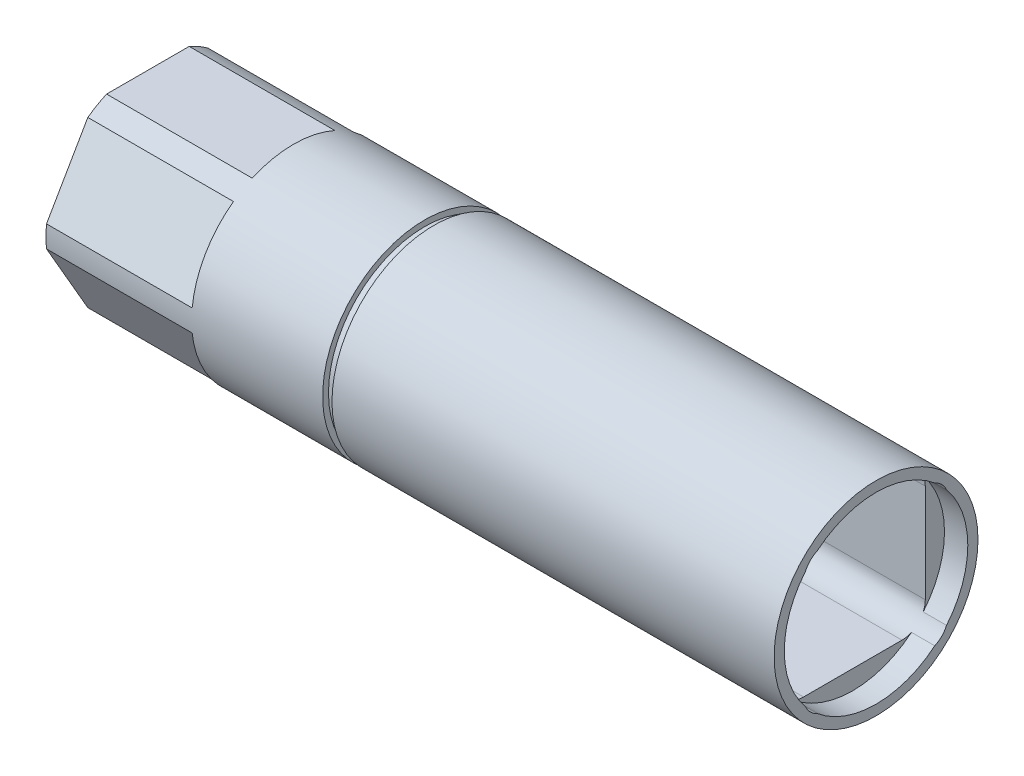
ISO-10303-21;
HEADER;
FILE_DESCRIPTION(('STEP AP214'),'2;1');
FILE_NAME('part.step','',(''),(''),'','','');
FILE_SCHEMA(('AUTOMOTIVE_DESIGN { 1 0 10303 214 1 1 1 1 }'));
ENDSEC;
DATA;
#1=APPLICATION_CONTEXT('core data for automotive mechanical design processes');
#2=APPLICATION_PROTOCOL_DEFINITION('international standard','automotive_design',2000,#1);
#3=PRODUCT_CONTEXT('',#1,'mechanical');
#4=PRODUCT('Part','Part','',(#3));
#5=PRODUCT_RELATED_PRODUCT_CATEGORY('part','',(#4));
#6=PRODUCT_DEFINITION_FORMATION('','',#4);
#7=PRODUCT_DEFINITION_CONTEXT('part definition',#1,'design');
#8=PRODUCT_DEFINITION('design','',#6,#7);
#9=PRODUCT_DEFINITION_SHAPE('','',#8);
#10=(LENGTH_UNIT() NAMED_UNIT(*) SI_UNIT(.MILLI.,.METRE.));
#11=(NAMED_UNIT(*) PLANE_ANGLE_UNIT() SI_UNIT($,.RADIAN.));
#12=(NAMED_UNIT(*) SI_UNIT($,.STERADIAN.) SOLID_ANGLE_UNIT());
#13=UNCERTAINTY_MEASURE_WITH_UNIT(LENGTH_MEASURE(1.E-05),#10,'distance_accuracy_value','');
#14=(GEOMETRIC_REPRESENTATION_CONTEXT(3) GLOBAL_UNCERTAINTY_ASSIGNED_CONTEXT((#13)) GLOBAL_UNIT_ASSIGNED_CONTEXT((#10,
#11,#12)) REPRESENTATION_CONTEXT('',''));
#15=CARTESIAN_POINT('',(0.,0.,0.));
#16=DIRECTION('',(0.,0.,1.));
#17=DIRECTION('',(1.,0.,0.));
#18=AXIS2_PLACEMENT_3D('',#15,#16,#17);
#19=CARTESIAN_POINT('',(0.,0.,0.));
#20=DIRECTION('',(1.,0.,0.));
#21=DIRECTION('',(0.,0.,-1.));
#22=AXIS2_PLACEMENT_3D('',#19,#20,#21);
#23=CYLINDRICAL_SURFACE('',#22,17.5);
#24=CARTESIAN_POINT('',(125.,0.,0.));
#25=DIRECTION('',(1.,0.,0.));
#26=DIRECTION('',(0.,0.,-1.));
#27=AXIS2_PLACEMENT_3D('',#24,#25,#26);
#28=CIRCLE('',#27,17.5);
#29=CARTESIAN_POINT('',(125.,0.,-17.5));
#30=VERTEX_POINT('',#29);
#31=EDGE_CURVE('E366',#30,#30,#28,.T.);
#32=ORIENTED_EDGE('',*,*,#31,.F.);
#33=EDGE_LOOP('',(#32));
#34=FACE_BOUND('',#33,.T.);
#35=CARTESIAN_POINT('',(49.1,0.,0.));
#36=DIRECTION('',(-1.,0.,0.));
#37=DIRECTION('',(0.,0.,1.));
#38=AXIS2_PLACEMENT_3D('',#35,#36,#37);
#39=CIRCLE('',#38,17.5);
#40=CARTESIAN_POINT('',(49.1,0.,17.5));
#41=VERTEX_POINT('',#40);
#42=EDGE_CURVE('E259',#41,#41,#39,.F.);
#43=ORIENTED_EDGE('',*,*,#42,.T.);
#44=EDGE_LOOP('',(#43));
#45=FACE_BOUND('',#44,.T.);
#46=ADVANCED_FACE('F50',(#34,#45),#23,.T.);
#47=CARTESIAN_POINT('',(121.,0.,0.));
#48=DIRECTION('',(1.,0.,0.));
#49=DIRECTION('',(0.,0.,-1.));
#50=AXIS2_PLACEMENT_3D('',#47,#48,#49);
#51=CYLINDRICAL_SURFACE('',#50,15.75);
#52=DIRECTION('',(-1.,0.,0.));
#53=VECTOR('',#52,1.);
#54=CARTESIAN_POINT('',(121.,10.0776325306588,12.1038763450808));
#55=LINE('',#54,#53);
#56=CARTESIAN_POINT('',(125.,10.0776325306588,12.1038763450808));
#57=VERTEX_POINT('',#56);
#58=CARTESIAN_POINT('',(121.,10.0776325306588,12.1038763450808));
#59=VERTEX_POINT('',#58);
#60=EDGE_CURVE('E354',#57,#59,#55,.T.);
#61=ORIENTED_EDGE('',*,*,#60,.F.);
#62=CARTESIAN_POINT('',(125.,0.,0.));
#63=DIRECTION('',(1.,0.,0.));
#64=DIRECTION('',(0.,0.,-1.));
#65=AXIS2_PLACEMENT_3D('',#62,#63,#64);
#66=CIRCLE('',#65,15.75);
#67=CARTESIAN_POINT('',(125.,-10.0776325306588,12.1038763450808));
#68=VERTEX_POINT('',#67);
#69=EDGE_CURVE('E587',#57,#68,#66,.T.);
#70=ORIENTED_EDGE('',*,*,#69,.T.);
#71=DIRECTION('',(-1.,0.,0.));
#72=VECTOR('',#71,1.);
#73=CARTESIAN_POINT('',(121.,-10.0776325306588,12.1038763450808));
#74=LINE('',#73,#72);
#75=CARTESIAN_POINT('',(121.,-10.0776325306588,12.1038763450808));
#76=VERTEX_POINT('',#75);
#77=EDGE_CURVE('E342',#76,#68,#74,.F.);
#78=ORIENTED_EDGE('',*,*,#77,.F.);
#79=CARTESIAN_POINT('',(121.,0.,0.));
#80=DIRECTION('',(1.,0.,0.));
#81=DIRECTION('',(0.,0.,-1.));
#82=AXIS2_PLACEMENT_3D('',#79,#80,#81);
#83=CIRCLE('',#82,15.75);
#84=EDGE_CURVE('E616',#59,#76,#83,.T.);
#85=ORIENTED_EDGE('',*,*,#84,.F.);
#86=EDGE_LOOP('',(#61,#70,#78,#85));
#87=FACE_BOUND('',#86,.T.);
#88=ADVANCED_FACE('F467',(#87),#51,.F.);
#89=DIRECTION('',(-1.,0.,0.));
#90=VECTOR('',#89,1.);
#91=CARTESIAN_POINT('',(121.,12.1038763450808,10.0776325306588));
#92=LINE('',#91,#90);
#93=CARTESIAN_POINT('',(121.,12.1038763450808,10.0776325306588));
#94=VERTEX_POINT('',#93);
#95=CARTESIAN_POINT('',(125.,12.1038763450808,10.0776325306588));
#96=VERTEX_POINT('',#95);
#97=EDGE_CURVE('E349',#94,#96,#92,.F.);
#98=ORIENTED_EDGE('',*,*,#97,.F.);
#99=CARTESIAN_POINT('',(121.,12.1038763450808,-10.0776325306588));
#100=VERTEX_POINT('',#99);
#101=EDGE_CURVE('E362',#100,#94,#83,.T.);
#102=ORIENTED_EDGE('',*,*,#101,.F.);
#103=DIRECTION('',(-1.,0.,0.));
#104=VECTOR('',#103,1.);
#105=CARTESIAN_POINT('',(121.,12.1038763450808,-10.0776325306588));
#106=LINE('',#105,#104);
#107=CARTESIAN_POINT('',(125.,12.1038763450808,-10.0776325306588));
#108=VERTEX_POINT('',#107);
#109=EDGE_CURVE('E333',#108,#100,#106,.T.);
#110=ORIENTED_EDGE('',*,*,#109,.F.);
#111=EDGE_CURVE('E361',#108,#96,#66,.T.);
#112=ORIENTED_EDGE('',*,*,#111,.T.);
#113=EDGE_LOOP('',(#98,#102,#110,#112));
#114=FACE_BOUND('',#113,.T.);
#115=ADVANCED_FACE('F472',(#114),#51,.F.);
#116=DIRECTION('',(-1.,0.,0.));
#117=VECTOR('',#116,1.);
#118=CARTESIAN_POINT('',(121.,-12.1038763450808,10.0776325306588));
#119=LINE('',#118,#117);
#120=CARTESIAN_POINT('',(125.,-12.1038763450808,10.0776325306588));
#121=VERTEX_POINT('',#120);
#122=CARTESIAN_POINT('',(121.,-12.1038763450808,10.0776325306588));
#123=VERTEX_POINT('',#122);
#124=EDGE_CURVE('E347',#121,#123,#119,.T.);
#125=ORIENTED_EDGE('',*,*,#124,.F.);
#126=CARTESIAN_POINT('',(125.,-12.1038763450808,-10.0776325306588));
#127=VERTEX_POINT('',#126);
#128=EDGE_CURVE('E365',#121,#127,#66,.T.);
#129=ORIENTED_EDGE('',*,*,#128,.T.);
#130=DIRECTION('',(-1.,0.,0.));
#131=VECTOR('',#130,1.);
#132=CARTESIAN_POINT('',(121.,-12.1038763450808,-10.0776325306588));
#133=LINE('',#132,#131);
#134=CARTESIAN_POINT('',(121.,-12.1038763450808,-10.0776325306588));
#135=VERTEX_POINT('',#134);
#136=EDGE_CURVE('E335',#135,#127,#133,.F.);
#137=ORIENTED_EDGE('',*,*,#136,.F.);
#138=EDGE_CURVE('E360',#123,#135,#83,.T.);
#139=ORIENTED_EDGE('',*,*,#138,.F.);
#140=EDGE_LOOP('',(#125,#129,#137,#139));
#141=FACE_BOUND('',#140,.T.);
#142=ADVANCED_FACE('F597',(#141),#51,.F.);
#143=DIRECTION('',(-1.,0.,0.));
#144=VECTOR('',#143,1.);
#145=CARTESIAN_POINT('',(121.,-10.0776325306588,-12.1038763450808));
#146=LINE('',#145,#144);
#147=CARTESIAN_POINT('',(125.,-10.0776325306588,-12.1038763450808));
#148=VERTEX_POINT('',#147);
#149=CARTESIAN_POINT('',(121.,-10.0776325306588,-12.1038763450808));
#150=VERTEX_POINT('',#149);
#151=EDGE_CURVE('E340',#148,#150,#146,.T.);
#152=ORIENTED_EDGE('',*,*,#151,.F.);
#153=CARTESIAN_POINT('',(125.,10.0776325306588,-12.1038763450808));
#154=VERTEX_POINT('',#153);
#155=EDGE_CURVE('E356',#148,#154,#66,.T.);
#156=ORIENTED_EDGE('',*,*,#155,.T.);
#157=DIRECTION('',(-1.,0.,0.));
#158=VECTOR('',#157,1.);
#159=CARTESIAN_POINT('',(121.,10.0776325306588,-12.1038763450808));
#160=LINE('',#159,#158);
#161=CARTESIAN_POINT('',(121.,10.0776325306588,-12.1038763450808));
#162=VERTEX_POINT('',#161);
#163=EDGE_CURVE('E328',#162,#154,#160,.F.);
#164=ORIENTED_EDGE('',*,*,#163,.F.);
#165=EDGE_CURVE('E357',#150,#162,#83,.T.);
#166=ORIENTED_EDGE('',*,*,#165,.F.);
#167=EDGE_LOOP('',(#152,#156,#164,#166));
#168=FACE_BOUND('',#167,.T.);
#169=ADVANCED_FACE('F475',(#168),#51,.F.);
#170=CARTESIAN_POINT('',(121.,0.,0.));
#171=DIRECTION('',(1.,0.,0.));
#172=DIRECTION('',(0.,0.,-1.));
#173=AXIS2_PLACEMENT_3D('',#170,#171,#172);
#174=PLANE('',#173);
#175=DIRECTION('',(0.,1.,0.));
#176=VECTOR('',#175,1.);
#177=CARTESIAN_POINT('',(121.,0.,12.45));
#178=LINE('',#177,#176);
#179=CARTESIAN_POINT('',(121.,-8.45,12.45));
#180=VERTEX_POINT('',#179);
#181=CARTESIAN_POINT('',(121.,8.45,12.45));
#182=VERTEX_POINT('',#181);
#183=EDGE_CURVE('E399',#180,#182,#178,.T.);
#184=ORIENTED_EDGE('',*,*,#183,.T.);
#185=CARTESIAN_POINT('',(121.,8.45,8.45));
#186=DIRECTION('',(1.,0.,0.));
#187=DIRECTION('',(0.,0.,-1.));
#188=AXIS2_PLACEMENT_3D('',#185,#186,#187);
#189=CIRCLE('',#188,4.);
#190=EDGE_CURVE('E384',#182,#59,#189,.F.);
#191=ORIENTED_EDGE('',*,*,#190,.T.);
#192=ORIENTED_EDGE('',*,*,#84,.T.);
#193=CARTESIAN_POINT('',(121.,-8.45,8.45));
#194=DIRECTION('',(1.,0.,0.));
#195=DIRECTION('',(0.,0.,-1.));
#196=AXIS2_PLACEMENT_3D('',#193,#194,#195);
#197=CIRCLE('',#196,4.);
#198=EDGE_CURVE('E398',#76,#180,#197,.F.);
#199=ORIENTED_EDGE('',*,*,#198,.T.);
#200=EDGE_LOOP('',(#184,#191,#192,#199));
#201=FACE_BOUND('',#200,.T.);
#202=ADVANCED_FACE('F572',(#201),#174,.T.);
#203=DIRECTION('',(0.,0.,1.));
#204=VECTOR('',#203,1.);
#205=CARTESIAN_POINT('',(121.,-12.45,0.));
#206=LINE('',#205,#204);
#207=CARTESIAN_POINT('',(121.,-12.45,-8.45));
#208=VERTEX_POINT('',#207);
#209=CARTESIAN_POINT('',(121.,-12.45,8.45));
#210=VERTEX_POINT('',#209);
#211=EDGE_CURVE('E392',#208,#210,#206,.T.);
#212=ORIENTED_EDGE('',*,*,#211,.T.);
#213=EDGE_CURVE('E395',#210,#123,#197,.F.);
#214=ORIENTED_EDGE('',*,*,#213,.T.);
#215=ORIENTED_EDGE('',*,*,#138,.T.);
#216=CARTESIAN_POINT('',(121.,-8.45,-8.45));
#217=DIRECTION('',(1.,0.,0.));
#218=DIRECTION('',(0.,0.,-1.));
#219=AXIS2_PLACEMENT_3D('',#216,#217,#218);
#220=CIRCLE('',#219,4.);
#221=EDGE_CURVE('E391',#135,#208,#220,.F.);
#222=ORIENTED_EDGE('',*,*,#221,.T.);
#223=EDGE_LOOP('',(#212,#214,#215,#222));
#224=FACE_BOUND('',#223,.T.);
#225=ADVANCED_FACE('F574',(#224),#174,.T.);
#226=DIRECTION('',(0.,-1.,0.));
#227=VECTOR('',#226,1.);
#228=CARTESIAN_POINT('',(121.,0.,-12.45));
#229=LINE('',#228,#227);
#230=CARTESIAN_POINT('',(121.,8.45,-12.45));
#231=VERTEX_POINT('',#230);
#232=CARTESIAN_POINT('',(121.,-8.45,-12.45));
#233=VERTEX_POINT('',#232);
#234=EDGE_CURVE('E385',#231,#233,#229,.T.);
#235=ORIENTED_EDGE('',*,*,#234,.T.);
#236=EDGE_CURVE('E388',#233,#150,#220,.F.);
#237=ORIENTED_EDGE('',*,*,#236,.T.);
#238=ORIENTED_EDGE('',*,*,#165,.T.);
#239=CARTESIAN_POINT('',(121.,8.45,-8.45));
#240=DIRECTION('',(1.,0.,0.));
#241=DIRECTION('',(0.,0.,-1.));
#242=AXIS2_PLACEMENT_3D('',#239,#240,#241);
#243=CIRCLE('',#242,4.);
#244=EDGE_CURVE('E381',#162,#231,#243,.F.);
#245=ORIENTED_EDGE('',*,*,#244,.T.);
#246=EDGE_LOOP('',(#235,#237,#238,#245));
#247=FACE_BOUND('',#246,.T.);
#248=ADVANCED_FACE('F582',(#247),#174,.T.);
#249=ORIENTED_EDGE('',*,*,#101,.T.);
#250=CARTESIAN_POINT('',(121.,12.45,8.45));
#251=VERTEX_POINT('',#250);
#252=EDGE_CURVE('E380',#94,#251,#189,.F.);
#253=ORIENTED_EDGE('',*,*,#252,.T.);
#254=DIRECTION('',(0.,0.,-1.));
#255=VECTOR('',#254,1.);
#256=CARTESIAN_POINT('',(121.,12.45,0.));
#257=LINE('',#256,#255);
#258=CARTESIAN_POINT('',(121.,12.45,-8.45));
#259=VERTEX_POINT('',#258);
#260=EDGE_CURVE('E374',#251,#259,#257,.T.);
#261=ORIENTED_EDGE('',*,*,#260,.T.);
#262=EDGE_CURVE('E377',#259,#100,#243,.F.);
#263=ORIENTED_EDGE('',*,*,#262,.T.);
#264=EDGE_LOOP('',(#249,#253,#261,#263));
#265=FACE_BOUND('',#264,.T.);
#266=ADVANCED_FACE('F576',(#265),#174,.T.);
#267=CARTESIAN_POINT('',(125.,17.5,0.));
#268=DIRECTION('',(1.,0.,0.));
#269=DIRECTION('',(0.,0.,-1.));
#270=AXIS2_PLACEMENT_3D('',#267,#268,#269);
#271=PLANE('',#270);
#272=ORIENTED_EDGE('',*,*,#69,.F.);
#273=CARTESIAN_POINT('',(125.,8.45,8.45));
#274=DIRECTION('',(1.,0.,0.));
#275=DIRECTION('',(0.,0.,-1.));
#276=AXIS2_PLACEMENT_3D('',#273,#274,#275);
#277=CIRCLE('',#276,4.);
#278=EDGE_CURVE('E351',#57,#96,#277,.F.);
#279=ORIENTED_EDGE('',*,*,#278,.T.);
#280=ORIENTED_EDGE('',*,*,#111,.F.);
#281=CARTESIAN_POINT('',(125.,8.45,-8.45));
#282=DIRECTION('',(1.,0.,0.));
#283=DIRECTION('',(0.,0.,-1.));
#284=AXIS2_PLACEMENT_3D('',#281,#282,#283);
#285=CIRCLE('',#284,4.);
#286=EDGE_CURVE('E330',#108,#154,#285,.F.);
#287=ORIENTED_EDGE('',*,*,#286,.T.);
#288=ORIENTED_EDGE('',*,*,#155,.F.);
#289=CARTESIAN_POINT('',(125.,-8.45,-8.45));
#290=DIRECTION('',(1.,0.,0.));
#291=DIRECTION('',(0.,0.,-1.));
#292=AXIS2_PLACEMENT_3D('',#289,#290,#291);
#293=CIRCLE('',#292,4.);
#294=EDGE_CURVE('E337',#148,#127,#293,.F.);
#295=ORIENTED_EDGE('',*,*,#294,.T.);
#296=ORIENTED_EDGE('',*,*,#128,.F.);
#297=CARTESIAN_POINT('',(125.,-8.45,8.45));
#298=DIRECTION('',(1.,0.,0.));
#299=DIRECTION('',(0.,0.,-1.));
#300=AXIS2_PLACEMENT_3D('',#297,#298,#299);
#301=CIRCLE('',#300,4.);
#302=EDGE_CURVE('E344',#121,#68,#301,.F.);
#303=ORIENTED_EDGE('',*,*,#302,.T.);
#304=EDGE_LOOP('',(#272,#279,#280,#287,#288,#295,#296,#303));
#305=FACE_BOUND('',#304,.T.);
#306=ORIENTED_EDGE('',*,*,#31,.T.);
#307=EDGE_LOOP('',(#306));
#308=FACE_BOUND('',#307,.T.);
#309=ADVANCED_FACE('F570',(#305,#308),#271,.T.);
#310=CARTESIAN_POINT('',(146.,8.45,8.45));
#311=DIRECTION('',(-1.,0.,0.));
#312=DIRECTION('',(0.,0.,1.));
#313=AXIS2_PLACEMENT_3D('',#310,#311,#312);
#314=CYLINDRICAL_SURFACE('',#313,4.);
#315=DIRECTION('',(-1.,0.,0.));
#316=VECTOR('',#315,1.);
#317=CARTESIAN_POINT('',(146.,8.45,12.45));
#318=LINE('',#317,#316);
#319=CARTESIAN_POINT('',(96.,8.45,12.45));
#320=VERTEX_POINT('',#319);
#321=EDGE_CURVE('E326',#182,#320,#318,.T.);
#322=ORIENTED_EDGE('',*,*,#321,.T.);
#323=CARTESIAN_POINT('',(96.,8.45,8.45));
#324=DIRECTION('',(1.,0.,0.));
#325=DIRECTION('',(0.,0.,1.));
#326=AXIS2_PLACEMENT_3D('',#323,#324,#325);
#327=CIRCLE('',#326,4.);
#328=CARTESIAN_POINT('',(96.,12.45,8.45));
#329=VERTEX_POINT('',#328);
#330=EDGE_CURVE('E271',#329,#320,#327,.T.);
#331=ORIENTED_EDGE('',*,*,#330,.F.);
#332=DIRECTION('',(-1.,0.,0.));
#333=VECTOR('',#332,1.);
#334=CARTESIAN_POINT('',(146.,12.45,8.45));
#335=LINE('',#334,#333);
#336=EDGE_CURVE('E312',#251,#329,#335,.T.);
#337=ORIENTED_EDGE('',*,*,#336,.F.);
#338=ORIENTED_EDGE('',*,*,#252,.F.);
#339=ORIENTED_EDGE('',*,*,#97,.T.);
#340=ORIENTED_EDGE('',*,*,#278,.F.);
#341=ORIENTED_EDGE('',*,*,#60,.T.);
#342=ORIENTED_EDGE('',*,*,#190,.F.);
#343=EDGE_LOOP('',(#322,#331,#337,#338,#339,#340,#341,#342));
#344=FACE_BOUND('',#343,.T.);
#345=ADVANCED_FACE('F566',(#344),#314,.F.);
#346=CARTESIAN_POINT('',(146.,8.45,12.45));
#347=DIRECTION('',(0.,0.,-1.));
#348=DIRECTION('',(0.,1.,0.));
#349=AXIS2_PLACEMENT_3D('',#346,#347,#348);
#350=PLANE('',#349);
#351=DIRECTION('',(-1.,0.,0.));
#352=VECTOR('',#351,1.);
#353=CARTESIAN_POINT('',(146.,-8.45,12.45));
#354=LINE('',#353,#352);
#355=CARTESIAN_POINT('',(96.,-8.45,12.45));
#356=VERTEX_POINT('',#355);
#357=EDGE_CURVE('E324',#180,#356,#354,.T.);
#358=ORIENTED_EDGE('',*,*,#357,.T.);
#359=DIRECTION('',(0.,-1.,0.));
#360=VECTOR('',#359,1.);
#361=CARTESIAN_POINT('',(96.,8.45,12.45));
#362=LINE('',#361,#360);
#363=EDGE_CURVE('E291',#320,#356,#362,.T.);
#364=ORIENTED_EDGE('',*,*,#363,.F.);
#365=ORIENTED_EDGE('',*,*,#321,.F.);
#366=ORIENTED_EDGE('',*,*,#183,.F.);
#367=EDGE_LOOP('',(#358,#364,#365,#366));
#368=FACE_BOUND('',#367,.T.);
#369=ADVANCED_FACE('F562',(#368),#350,.T.);
#370=CARTESIAN_POINT('',(146.,-8.45,8.45));
#371=DIRECTION('',(-1.,0.,0.));
#372=DIRECTION('',(0.,0.,1.));
#373=AXIS2_PLACEMENT_3D('',#370,#371,#372);
#374=CYLINDRICAL_SURFACE('',#373,4.);
#375=DIRECTION('',(-1.,0.,0.));
#376=VECTOR('',#375,1.);
#377=CARTESIAN_POINT('',(146.,-12.45,8.45));
#378=LINE('',#377,#376);
#379=CARTESIAN_POINT('',(96.,-12.45,8.45));
#380=VERTEX_POINT('',#379);
#381=EDGE_CURVE('E322',#210,#380,#378,.T.);
#382=ORIENTED_EDGE('',*,*,#381,.T.);
#383=CARTESIAN_POINT('',(96.,-8.45,8.45));
#384=DIRECTION('',(1.,0.,0.));
#385=DIRECTION('',(0.,0.,-1.));
#386=AXIS2_PLACEMENT_3D('',#383,#384,#385);
#387=CIRCLE('',#386,4.);
#388=EDGE_CURVE('E294',#356,#380,#387,.T.);
#389=ORIENTED_EDGE('',*,*,#388,.F.);
#390=ORIENTED_EDGE('',*,*,#357,.F.);
#391=ORIENTED_EDGE('',*,*,#198,.F.);
#392=ORIENTED_EDGE('',*,*,#77,.T.);
#393=ORIENTED_EDGE('',*,*,#302,.F.);
#394=ORIENTED_EDGE('',*,*,#124,.T.);
#395=ORIENTED_EDGE('',*,*,#213,.F.);
#396=EDGE_LOOP('',(#382,#389,#390,#391,#392,#393,#394,#395));
#397=FACE_BOUND('',#396,.T.);
#398=ADVANCED_FACE('F558',(#397),#374,.F.);
#399=CARTESIAN_POINT('',(146.,-12.45,8.45));
#400=DIRECTION('',(0.,1.,0.));
#401=DIRECTION('',(0.,0.,1.));
#402=AXIS2_PLACEMENT_3D('',#399,#400,#401);
#403=PLANE('',#402);
#404=DIRECTION('',(-1.,0.,0.));
#405=VECTOR('',#404,1.);
#406=CARTESIAN_POINT('',(146.,-12.45,-8.45));
#407=LINE('',#406,#405);
#408=CARTESIAN_POINT('',(96.,-12.45,-8.45));
#409=VERTEX_POINT('',#408);
#410=EDGE_CURVE('E320',#208,#409,#407,.T.);
#411=ORIENTED_EDGE('',*,*,#410,.T.);
#412=DIRECTION('',(0.,0.,-1.));
#413=VECTOR('',#412,1.);
#414=CARTESIAN_POINT('',(96.,-12.45,8.45));
#415=LINE('',#414,#413);
#416=EDGE_CURVE('E297',#380,#409,#415,.T.);
#417=ORIENTED_EDGE('',*,*,#416,.F.);
#418=ORIENTED_EDGE('',*,*,#381,.F.);
#419=ORIENTED_EDGE('',*,*,#211,.F.);
#420=EDGE_LOOP('',(#411,#417,#418,#419));
#421=FACE_BOUND('',#420,.T.);
#422=ADVANCED_FACE('F554',(#421),#403,.T.);
#423=CARTESIAN_POINT('',(146.,-8.45,-8.45));
#424=DIRECTION('',(-1.,0.,0.));
#425=DIRECTION('',(0.,0.,1.));
#426=AXIS2_PLACEMENT_3D('',#423,#424,#425);
#427=CYLINDRICAL_SURFACE('',#426,4.);
#428=DIRECTION('',(-1.,0.,0.));
#429=VECTOR('',#428,1.);
#430=CARTESIAN_POINT('',(146.,-8.45,-12.45));
#431=LINE('',#430,#429);
#432=CARTESIAN_POINT('',(96.,-8.45,-12.45));
#433=VERTEX_POINT('',#432);
#434=EDGE_CURVE('E318',#233,#433,#431,.T.);
#435=ORIENTED_EDGE('',*,*,#434,.T.);
#436=CARTESIAN_POINT('',(96.,-8.45,-8.45));
#437=DIRECTION('',(1.,0.,0.));
#438=DIRECTION('',(0.,0.,1.));
#439=AXIS2_PLACEMENT_3D('',#436,#437,#438);
#440=CIRCLE('',#439,4.);
#441=EDGE_CURVE('E300',#409,#433,#440,.T.);
#442=ORIENTED_EDGE('',*,*,#441,.F.);
#443=ORIENTED_EDGE('',*,*,#410,.F.);
#444=ORIENTED_EDGE('',*,*,#221,.F.);
#445=ORIENTED_EDGE('',*,*,#136,.T.);
#446=ORIENTED_EDGE('',*,*,#294,.F.);
#447=ORIENTED_EDGE('',*,*,#151,.T.);
#448=ORIENTED_EDGE('',*,*,#236,.F.);
#449=EDGE_LOOP('',(#435,#442,#443,#444,#445,#446,#447,#448));
#450=FACE_BOUND('',#449,.T.);
#451=ADVANCED_FACE('F550',(#450),#427,.F.);
#452=CARTESIAN_POINT('',(146.,8.45,-12.45));
#453=DIRECTION('',(0.,0.,1.));
#454=DIRECTION('',(1.,0.,0.));
#455=AXIS2_PLACEMENT_3D('',#452,#453,#454);
#456=PLANE('',#455);
#457=DIRECTION('',(-1.,0.,0.));
#458=VECTOR('',#457,1.);
#459=CARTESIAN_POINT('',(146.,8.45,-12.45));
#460=LINE('',#459,#458);
#461=CARTESIAN_POINT('',(96.,8.45,-12.45));
#462=VERTEX_POINT('',#461);
#463=EDGE_CURVE('E316',#231,#462,#460,.T.);
#464=ORIENTED_EDGE('',*,*,#463,.T.);
#465=DIRECTION('',(0.,1.,0.));
#466=VECTOR('',#465,1.);
#467=CARTESIAN_POINT('',(96.,8.45,-12.45));
#468=LINE('',#467,#466);
#469=EDGE_CURVE('E303',#433,#462,#468,.T.);
#470=ORIENTED_EDGE('',*,*,#469,.F.);
#471=ORIENTED_EDGE('',*,*,#434,.F.);
#472=ORIENTED_EDGE('',*,*,#234,.F.);
#473=EDGE_LOOP('',(#464,#470,#471,#472));
#474=FACE_BOUND('',#473,.T.);
#475=ADVANCED_FACE('F546',(#474),#456,.T.);
#476=CARTESIAN_POINT('',(146.,8.45,-8.45));
#477=DIRECTION('',(-1.,0.,0.));
#478=DIRECTION('',(0.,0.,1.));
#479=AXIS2_PLACEMENT_3D('',#476,#477,#478);
#480=CYLINDRICAL_SURFACE('',#479,4.);
#481=DIRECTION('',(-1.,0.,0.));
#482=VECTOR('',#481,1.);
#483=CARTESIAN_POINT('',(146.,12.45,-8.45));
#484=LINE('',#483,#482);
#485=CARTESIAN_POINT('',(96.,12.45,-8.45));
#486=VERTEX_POINT('',#485);
#487=EDGE_CURVE('E314',#259,#486,#484,.T.);
#488=ORIENTED_EDGE('',*,*,#487,.T.);
#489=CARTESIAN_POINT('',(96.,8.45,-8.45));
#490=DIRECTION('',(1.,0.,0.));
#491=DIRECTION('',(0.,0.,1.));
#492=AXIS2_PLACEMENT_3D('',#489,#490,#491);
#493=CIRCLE('',#492,4.);
#494=EDGE_CURVE('E306',#462,#486,#493,.T.);
#495=ORIENTED_EDGE('',*,*,#494,.F.);
#496=ORIENTED_EDGE('',*,*,#463,.F.);
#497=ORIENTED_EDGE('',*,*,#244,.F.);
#498=ORIENTED_EDGE('',*,*,#163,.T.);
#499=ORIENTED_EDGE('',*,*,#286,.F.);
#500=ORIENTED_EDGE('',*,*,#109,.T.);
#501=ORIENTED_EDGE('',*,*,#262,.F.);
#502=EDGE_LOOP('',(#488,#495,#496,#497,#498,#499,#500,#501));
#503=FACE_BOUND('',#502,.T.);
#504=ADVANCED_FACE('F542',(#503),#480,.F.);
#505=CARTESIAN_POINT('',(146.,12.45,8.45));
#506=DIRECTION('',(0.,-1.,0.));
#507=DIRECTION('',(0.,0.,-1.));
#508=AXIS2_PLACEMENT_3D('',#505,#506,#507);
#509=PLANE('',#508);
#510=ORIENTED_EDGE('',*,*,#336,.T.);
#511=DIRECTION('',(0.,0.,1.));
#512=VECTOR('',#511,1.);
#513=CARTESIAN_POINT('',(96.,12.45,8.45));
#514=LINE('',#513,#512);
#515=EDGE_CURVE('E309',#486,#329,#514,.T.);
#516=ORIENTED_EDGE('',*,*,#515,.F.);
#517=ORIENTED_EDGE('',*,*,#487,.F.);
#518=ORIENTED_EDGE('',*,*,#260,.F.);
#519=EDGE_LOOP('',(#510,#516,#517,#518));
#520=FACE_BOUND('',#519,.T.);
#521=ADVANCED_FACE('F538',(#520),#509,.T.);
#522=CARTESIAN_POINT('',(96.,8.45,8.45));
#523=DIRECTION('',(-1.,0.,0.));
#524=DIRECTION('',(0.,0.,1.));
#525=AXIS2_PLACEMENT_3D('',#522,#523,#524);
#526=PLANE('',#525);
#527=ORIENTED_EDGE('',*,*,#330,.T.);
#528=ORIENTED_EDGE('',*,*,#363,.T.);
#529=ORIENTED_EDGE('',*,*,#388,.T.);
#530=ORIENTED_EDGE('',*,*,#416,.T.);
#531=ORIENTED_EDGE('',*,*,#441,.T.);
#532=ORIENTED_EDGE('',*,*,#469,.T.);
#533=ORIENTED_EDGE('',*,*,#494,.T.);
#534=ORIENTED_EDGE('',*,*,#515,.T.);
#535=EDGE_LOOP('',(#527,#528,#529,#530,#531,#532,#533,#534));
#536=FACE_BOUND('',#535,.T.);
#537=ADVANCED_FACE('F452',(#536),#526,.F.);
#538=CARTESIAN_POINT('',(47.5,0.,-29.4669668590395));
#539=DIRECTION('',(1.,0.,0.));
#540=DIRECTION('',(0.,0.,-1.));
#541=AXIS2_PLACEMENT_3D('',#538,#539,#540);
#542=PLANE('',#541);
#543=CARTESIAN_POINT('',(47.5,0.,0.));
#544=DIRECTION('',(1.,0.,0.));
#545=DIRECTION('',(0.,0.,-1.));
#546=AXIS2_PLACEMENT_3D('',#543,#544,#545);
#547=CIRCLE('',#546,17.5);
#548=CARTESIAN_POINT('',(47.5,0.,-17.5));
#549=VERTEX_POINT('',#548);
#550=EDGE_CURVE('E54',#549,#549,#547,.F.);
#551=ORIENTED_EDGE('',*,*,#550,.F.);
#552=EDGE_LOOP('',(#551));
#553=FACE_BOUND('',#552,.T.);
#554=CARTESIAN_POINT('',(47.5,0.,0.));
#555=DIRECTION('',(-1.,0.,0.));
#556=DIRECTION('',(0.,0.,1.));
#557=AXIS2_PLACEMENT_3D('',#554,#555,#556);
#558=CIRCLE('',#557,16.5);
#559=CARTESIAN_POINT('',(47.5,0.,16.5));
#560=VERTEX_POINT('',#559);
#561=EDGE_CURVE('E252',#560,#560,#558,.T.);
#562=ORIENTED_EDGE('',*,*,#561,.T.);
#563=EDGE_LOOP('',(#562));
#564=FACE_BOUND('',#563,.T.);
#565=ADVANCED_FACE('F448',(#553,#564),#542,.T.);
#566=CARTESIAN_POINT('',(0.,0.,0.));
#567=DIRECTION('',(-1.,0.,0.));
#568=DIRECTION('',(0.,0.,1.));
#569=AXIS2_PLACEMENT_3D('',#566,#567,#568);
#570=CYLINDRICAL_SURFACE('',#569,16.5);
#571=CARTESIAN_POINT('',(49.1,0.,0.));
#572=DIRECTION('',(-1.,0.,0.));
#573=DIRECTION('',(0.,0.,1.));
#574=AXIS2_PLACEMENT_3D('',#571,#572,#573);
#575=CIRCLE('',#574,16.5);
#576=CARTESIAN_POINT('',(49.1,0.,16.5));
#577=VERTEX_POINT('',#576);
#578=EDGE_CURVE('E248',#577,#577,#575,.T.);
#579=ORIENTED_EDGE('',*,*,#578,.T.);
#580=EDGE_LOOP('',(#579));
#581=FACE_BOUND('',#580,.T.);
#582=ORIENTED_EDGE('',*,*,#561,.F.);
#583=EDGE_LOOP('',(#582));
#584=FACE_BOUND('',#583,.T.);
#585=ADVANCED_FACE('F451',(#581,#584),#570,.T.);
#586=CARTESIAN_POINT('',(49.1,0.,-29.4669668590395));
#587=DIRECTION('',(-1.,0.,0.));
#588=DIRECTION('',(0.,0.,1.));
#589=AXIS2_PLACEMENT_3D('',#586,#587,#588);
#590=PLANE('',#589);
#591=ORIENTED_EDGE('',*,*,#42,.F.);
#592=EDGE_LOOP('',(#591));
#593=FACE_BOUND('',#592,.T.);
#594=ORIENTED_EDGE('',*,*,#578,.F.);
#595=EDGE_LOOP('',(#594));
#596=FACE_BOUND('',#595,.T.);
#597=ADVANCED_FACE('F457',(#593,#596),#590,.T.);
#598=CARTESIAN_POINT('',(25.,0.,0.));
#599=DIRECTION('',(-1.,0.,0.));
#600=DIRECTION('',(0.,0.,1.));
#601=AXIS2_PLACEMENT_3D('',#598,#599,#600);
#602=PLANE('',#601);
#603=DIRECTION('',(0.,0.,-1.));
#604=VECTOR('',#603,1.);
#605=CARTESIAN_POINT('',(25.,16.,9.23760430703401));
#606=LINE('',#605,#604);
#607=CARTESIAN_POINT('',(25.,16.,7.08872343937891));
#608=VERTEX_POINT('',#607);
#609=CARTESIAN_POINT('',(25.,16.,-7.08872343937891));
#610=VERTEX_POINT('',#609);
#611=EDGE_CURVE('E261',#608,#610,#606,.T.);
#612=ORIENTED_EDGE('',*,*,#611,.F.);
#613=CARTESIAN_POINT('',(25.,0.,0.));
#614=DIRECTION('',(-1.,0.,0.));
#615=DIRECTION('',(0.,0.,1.));
#616=AXIS2_PLACEMENT_3D('',#613,#614,#615);
#617=CIRCLE('',#616,17.5);
#618=EDGE_CURVE('E405',#610,#608,#617,.F.);
#619=ORIENTED_EDGE('',*,*,#618,.F.);
#620=EDGE_LOOP('',(#612,#619));
#621=FACE_BOUND('',#620,.T.);
#622=ADVANCED_FACE('F463',(#621),#602,.T.);
#623=CARTESIAN_POINT('',(25.,16.,9.23760430703401));
#624=DIRECTION('',(0.,1.,0.));
#625=DIRECTION('',(0.,0.,1.));
#626=AXIS2_PLACEMENT_3D('',#623,#624,#625);
#627=PLANE('',#626);
#628=ORIENTED_EDGE('',*,*,#611,.T.);
#629=DIRECTION('',(1.,0.,0.));
#630=VECTOR('',#629,1.);
#631=CARTESIAN_POINT('',(0.,16.,-7.08872343937891));
#632=LINE('',#631,#630);
#633=CARTESIAN_POINT('',(0.,16.,-7.08872343937891));
#634=VERTEX_POINT('',#633);
#635=EDGE_CURVE('E402',#634,#610,#632,.T.);
#636=ORIENTED_EDGE('',*,*,#635,.F.);
#637=DIRECTION('',(0.,0.,-1.));
#638=VECTOR('',#637,1.);
#639=CARTESIAN_POINT('',(0.,16.,9.23760430703401));
#640=LINE('',#639,#638);
#641=CARTESIAN_POINT('',(0.,16.,7.08872343937891));
#642=VERTEX_POINT('',#641);
#643=EDGE_CURVE('E275',#642,#634,#640,.T.);
#644=ORIENTED_EDGE('',*,*,#643,.F.);
#645=DIRECTION('',(1.,0.,0.));
#646=VECTOR('',#645,1.);
#647=CARTESIAN_POINT('',(0.,16.,7.08872343937891));
#648=LINE('',#647,#646);
#649=EDGE_CURVE('E408',#608,#642,#648,.F.);
#650=ORIENTED_EDGE('',*,*,#649,.F.);
#651=EDGE_LOOP('',(#628,#636,#644,#650));
#652=FACE_BOUND('',#651,.T.);
#653=ADVANCED_FACE('F523',(#652),#627,.T.);
#654=DIRECTION('',(0.,-0.866025403784439,-0.5));
#655=VECTOR('',#654,1.);
#656=CARTESIAN_POINT('',(25.,16.,-9.23760430703401));
#657=LINE('',#656,#655);
#658=CARTESIAN_POINT('',(25.,14.1390145789043,-10.3120447408616));
#659=VERTEX_POINT('',#658);
#660=CARTESIAN_POINT('',(25.,1.86098542109566,-17.4007681802405));
#661=VERTEX_POINT('',#660);
#662=EDGE_CURVE('E264',#659,#661,#657,.T.);
#663=ORIENTED_EDGE('',*,*,#662,.F.);
#664=EDGE_CURVE('E409',#661,#659,#617,.F.);
#665=ORIENTED_EDGE('',*,*,#664,.F.);
#666=EDGE_LOOP('',(#663,#665));
#667=FACE_BOUND('',#666,.T.);
#668=ADVANCED_FACE('F503',(#667),#602,.T.);
#669=CARTESIAN_POINT('',(25.,16.,-9.23760430703401));
#670=DIRECTION('',(0.,0.5,-0.866025403784439));
#671=DIRECTION('',(0.,0.866025403784439,0.5));
#672=AXIS2_PLACEMENT_3D('',#669,#670,#671);
#673=PLANE('',#672);
#674=ORIENTED_EDGE('',*,*,#662,.T.);
#675=DIRECTION('',(1.,0.,0.));
#676=VECTOR('',#675,1.);
#677=CARTESIAN_POINT('',(0.,1.86098542109566,-17.4007681802405));
#678=LINE('',#677,#676);
#679=CARTESIAN_POINT('',(0.,1.86098542109566,-17.4007681802405));
#680=VERTEX_POINT('',#679);
#681=EDGE_CURVE('E412',#680,#661,#678,.T.);
#682=ORIENTED_EDGE('',*,*,#681,.F.);
#683=DIRECTION('',(0.,-0.866025403784439,-0.5));
#684=VECTOR('',#683,1.);
#685=CARTESIAN_POINT('',(0.,16.,-9.23760430703401));
#686=LINE('',#685,#684);
#687=CARTESIAN_POINT('',(0.,14.1390145789043,-10.3120447408616));
#688=VERTEX_POINT('',#687);
#689=EDGE_CURVE('E278',#688,#680,#686,.T.);
#690=ORIENTED_EDGE('',*,*,#689,.F.);
#691=DIRECTION('',(1.,0.,0.));
#692=VECTOR('',#691,1.);
#693=CARTESIAN_POINT('',(0.,14.1390145789043,-10.3120447408616));
#694=LINE('',#693,#692);
#695=EDGE_CURVE('E415',#659,#688,#694,.F.);
#696=ORIENTED_EDGE('',*,*,#695,.F.);
#697=EDGE_LOOP('',(#674,#682,#690,#696));
#698=FACE_BOUND('',#697,.T.);
#699=ADVANCED_FACE('F505',(#698),#673,.T.);
#700=DIRECTION('',(0.,-0.866025403784439,0.5));
#701=VECTOR('',#700,1.);
#702=CARTESIAN_POINT('',(25.,0.,-18.475208614068));
#703=LINE('',#702,#701);
#704=CARTESIAN_POINT('',(25.,-1.86098542109567,-17.4007681802405));
#705=VERTEX_POINT('',#704);
#706=CARTESIAN_POINT('',(25.,-14.1390145789043,-10.3120447408616));
#707=VERTEX_POINT('',#706);
#708=EDGE_CURVE('E266',#705,#707,#703,.T.);
#709=ORIENTED_EDGE('',*,*,#708,.F.);
#710=EDGE_CURVE('E421',#707,#705,#617,.F.);
#711=ORIENTED_EDGE('',*,*,#710,.F.);
#712=EDGE_LOOP('',(#709,#711));
#713=FACE_BOUND('',#712,.T.);
#714=ADVANCED_FACE('F512',(#713),#602,.T.);
#715=CARTESIAN_POINT('',(25.,0.,-18.475208614068));
#716=DIRECTION('',(0.,-0.5,-0.866025403784439));
#717=DIRECTION('',(0.,0.866025403784439,-0.5));
#718=AXIS2_PLACEMENT_3D('',#715,#716,#717);
#719=PLANE('',#718);
#720=ORIENTED_EDGE('',*,*,#708,.T.);
#721=DIRECTION('',(1.,0.,0.));
#722=VECTOR('',#721,1.);
#723=CARTESIAN_POINT('',(0.,-14.1390145789043,-10.3120447408616));
#724=LINE('',#723,#722);
#725=CARTESIAN_POINT('',(0.,-14.1390145789043,-10.3120447408616));
#726=VERTEX_POINT('',#725);
#727=EDGE_CURVE('E418',#726,#707,#724,.T.);
#728=ORIENTED_EDGE('',*,*,#727,.F.);
#729=DIRECTION('',(0.,-0.866025403784439,0.5));
#730=VECTOR('',#729,1.);
#731=CARTESIAN_POINT('',(0.,0.,-18.475208614068));
#732=LINE('',#731,#730);
#733=CARTESIAN_POINT('',(0.,-1.86098542109567,-17.4007681802405));
#734=VERTEX_POINT('',#733);
#735=EDGE_CURVE('E281',#734,#726,#732,.T.);
#736=ORIENTED_EDGE('',*,*,#735,.F.);
#737=DIRECTION('',(1.,0.,0.));
#738=VECTOR('',#737,1.);
#739=CARTESIAN_POINT('',(0.,-1.86098542109567,-17.4007681802405));
#740=LINE('',#739,#738);
#741=EDGE_CURVE('E422',#705,#734,#740,.F.);
#742=ORIENTED_EDGE('',*,*,#741,.F.);
#743=EDGE_LOOP('',(#720,#728,#736,#742));
#744=FACE_BOUND('',#743,.T.);
#745=ADVANCED_FACE('F510',(#744),#719,.T.);
#746=DIRECTION('',(0.,0.,1.));
#747=VECTOR('',#746,1.);
#748=CARTESIAN_POINT('',(25.,-16.,-9.23760430703402));
#749=LINE('',#748,#747);
#750=CARTESIAN_POINT('',(25.,-16.,-7.08872343937893));
#751=VERTEX_POINT('',#750);
#752=CARTESIAN_POINT('',(25.,-16.,7.08872343937892));
#753=VERTEX_POINT('',#752);
#754=EDGE_CURVE('E268',#751,#753,#749,.T.);
#755=ORIENTED_EDGE('',*,*,#754,.F.);
#756=EDGE_CURVE('E428',#753,#751,#617,.F.);
#757=ORIENTED_EDGE('',*,*,#756,.F.);
#758=EDGE_LOOP('',(#755,#757));
#759=FACE_BOUND('',#758,.T.);
#760=ADVANCED_FACE('F761',(#759),#602,.T.);
#761=CARTESIAN_POINT('',(25.,-16.,-9.23760430703402));
#762=DIRECTION('',(0.,-1.,0.));
#763=DIRECTION('',(0.,0.,-1.));
#764=AXIS2_PLACEMENT_3D('',#761,#762,#763);
#765=PLANE('',#764);
#766=ORIENTED_EDGE('',*,*,#754,.T.);
#767=DIRECTION('',(1.,0.,0.));
#768=VECTOR('',#767,1.);
#769=CARTESIAN_POINT('',(0.,-16.,7.08872343937892));
#770=LINE('',#769,#768);
#771=CARTESIAN_POINT('',(0.,-16.,7.08872343937892));
#772=VERTEX_POINT('',#771);
#773=EDGE_CURVE('E425',#772,#753,#770,.T.);
#774=ORIENTED_EDGE('',*,*,#773,.F.);
#775=DIRECTION('',(0.,0.,1.));
#776=VECTOR('',#775,1.);
#777=CARTESIAN_POINT('',(0.,-16.,-9.23760430703402));
#778=LINE('',#777,#776);
#779=CARTESIAN_POINT('',(0.,-16.,-7.08872343937893));
#780=VERTEX_POINT('',#779);
#781=EDGE_CURVE('E284',#780,#772,#778,.T.);
#782=ORIENTED_EDGE('',*,*,#781,.F.);
#783=DIRECTION('',(1.,0.,0.));
#784=VECTOR('',#783,1.);
#785=CARTESIAN_POINT('',(0.,-16.,-7.08872343937893));
#786=LINE('',#785,#784);
#787=EDGE_CURVE('E429',#751,#780,#786,.F.);
#788=ORIENTED_EDGE('',*,*,#787,.F.);
#789=EDGE_LOOP('',(#766,#774,#782,#788));
#790=FACE_BOUND('',#789,.T.);
#791=ADVANCED_FACE('F774',(#790),#765,.T.);
#792=DIRECTION('',(0.,0.866025403784439,0.5));
#793=VECTOR('',#792,1.);
#794=CARTESIAN_POINT('',(25.,-16.,9.237604307034));
#795=LINE('',#794,#793);
#796=CARTESIAN_POINT('',(25.,-14.1390145789044,10.3120447408615));
#797=VERTEX_POINT('',#796);
#798=CARTESIAN_POINT('',(25.,-1.86098542109565,17.4007681802405));
#799=VERTEX_POINT('',#798);
#800=EDGE_CURVE('E75',#797,#799,#795,.T.);
#801=ORIENTED_EDGE('',*,*,#800,.F.);
#802=EDGE_CURVE('E435',#799,#797,#617,.F.);
#803=ORIENTED_EDGE('',*,*,#802,.F.);
#804=EDGE_LOOP('',(#801,#803));
#805=FACE_BOUND('',#804,.T.);
#806=ADVANCED_FACE('F487',(#805),#602,.T.);
#807=CARTESIAN_POINT('',(25.,-16.,9.237604307034));
#808=DIRECTION('',(0.,-0.5,0.866025403784438));
#809=DIRECTION('',(0.,-0.866025403784438,-0.5));
#810=AXIS2_PLACEMENT_3D('',#807,#808,#809);
#811=PLANE('',#810);
#812=ORIENTED_EDGE('',*,*,#800,.T.);
#813=DIRECTION('',(1.,0.,0.));
#814=VECTOR('',#813,1.);
#815=CARTESIAN_POINT('',(0.,-1.86098542109565,17.4007681802405));
#816=LINE('',#815,#814);
#817=CARTESIAN_POINT('',(0.,-1.86098542109564,17.4007681802405));
#818=VERTEX_POINT('',#817);
#819=EDGE_CURVE('E432',#818,#799,#816,.T.);
#820=ORIENTED_EDGE('',*,*,#819,.F.);
#821=DIRECTION('',(0.,0.866025403784439,0.5));
#822=VECTOR('',#821,1.);
#823=CARTESIAN_POINT('',(0.,-16.,9.237604307034));
#824=LINE('',#823,#822);
#825=CARTESIAN_POINT('',(0.,-14.1390145789044,10.3120447408615));
#826=VERTEX_POINT('',#825);
#827=EDGE_CURVE('E262',#826,#818,#824,.T.);
#828=ORIENTED_EDGE('',*,*,#827,.F.);
#829=DIRECTION('',(1.,0.,0.));
#830=VECTOR('',#829,1.);
#831=CARTESIAN_POINT('',(0.,-14.1390145789044,10.3120447408615));
#832=LINE('',#831,#830);
#833=EDGE_CURVE('E436',#797,#826,#832,.F.);
#834=ORIENTED_EDGE('',*,*,#833,.F.);
#835=EDGE_LOOP('',(#812,#820,#828,#834));
#836=FACE_BOUND('',#835,.T.);
#837=ADVANCED_FACE('F531',(#836),#811,.T.);
#838=CARTESIAN_POINT('',(0.,0.,0.));
#839=DIRECTION('',(-1.,0.,0.));
#840=DIRECTION('',(0.,0.,1.));
#841=AXIS2_PLACEMENT_3D('',#838,#839,#840);
#842=PLANE('',#841);
#843=CARTESIAN_POINT('',(0.,0.,0.));
#844=DIRECTION('',(-1.,0.,0.));
#845=DIRECTION('',(0.,0.,1.));
#846=AXIS2_PLACEMENT_3D('',#843,#844,#845);
#847=CIRCLE('',#846,4.25);
#848=CARTESIAN_POINT('',(0.,0.,4.25));
#849=VERTEX_POINT('',#848);
#850=EDGE_CURVE('E249',#849,#849,#847,.T.);
#851=ORIENTED_EDGE('',*,*,#850,.F.);
#852=EDGE_LOOP('',(#851));
#853=FACE_BOUND('',#852,.T.);
#854=CARTESIAN_POINT('',(0.,0.,0.));
#855=DIRECTION('',(1.,0.,0.));
#856=DIRECTION('',(0.,0.,-1.));
#857=AXIS2_PLACEMENT_3D('',#854,#855,#856);
#858=CIRCLE('',#857,17.5);
#859=CARTESIAN_POINT('',(0.,1.86098542109565,17.4007681802405));
#860=VERTEX_POINT('',#859);
#861=EDGE_CURVE('E518',#860,#818,#858,.T.);
#862=ORIENTED_EDGE('',*,*,#861,.F.);
#863=DIRECTION('',(0.,0.866025403784439,-0.5));
#864=VECTOR('',#863,1.);
#865=CARTESIAN_POINT('',(0.,0.,18.475208614068));
#866=LINE('',#865,#864);
#867=CARTESIAN_POINT('',(0.,14.1390145789043,10.3120447408616));
#868=VERTEX_POINT('',#867);
#869=EDGE_CURVE('E272',#860,#868,#866,.T.);
#870=ORIENTED_EDGE('',*,*,#869,.T.);
#871=EDGE_CURVE('E519',#642,#868,#858,.T.);
#872=ORIENTED_EDGE('',*,*,#871,.F.);
#873=ORIENTED_EDGE('',*,*,#643,.T.);
#874=EDGE_CURVE('E373',#688,#634,#858,.T.);
#875=ORIENTED_EDGE('',*,*,#874,.F.);
#876=ORIENTED_EDGE('',*,*,#689,.T.);
#877=EDGE_CURVE('E369',#734,#680,#858,.T.);
#878=ORIENTED_EDGE('',*,*,#877,.F.);
#879=ORIENTED_EDGE('',*,*,#735,.T.);
#880=EDGE_CURVE('E372',#780,#726,#858,.T.);
#881=ORIENTED_EDGE('',*,*,#880,.F.);
#882=ORIENTED_EDGE('',*,*,#781,.T.);
#883=EDGE_CURVE('E517',#826,#772,#858,.T.);
#884=ORIENTED_EDGE('',*,*,#883,.F.);
#885=ORIENTED_EDGE('',*,*,#827,.T.);
#886=EDGE_LOOP('',(#862,#870,#872,#873,#875,#876,#878,#879,#881,#882,#884,#885));
#887=FACE_BOUND('',#886,.T.);
#888=ADVANCED_FACE('F52',(#853,#887),#842,.T.);
#889=CARTESIAN_POINT('',(25.,0.,18.475208614068));
#890=DIRECTION('',(0.,0.5,0.866025403784439));
#891=DIRECTION('',(0.,-0.866025403784439,0.5));
#892=AXIS2_PLACEMENT_3D('',#889,#890,#891);
#893=PLANE('',#892);
#894=DIRECTION('',(0.,0.866025403784439,-0.5));
#895=VECTOR('',#894,1.);
#896=CARTESIAN_POINT('',(25.,0.,18.475208614068));
#897=LINE('',#896,#895);
#898=CARTESIAN_POINT('',(25.,1.86098542109565,17.4007681802405));
#899=VERTEX_POINT('',#898);
#900=CARTESIAN_POINT('',(25.,14.1390145789043,10.3120447408616));
#901=VERTEX_POINT('',#900);
#902=EDGE_CURVE('E67',#899,#901,#897,.T.);
#903=ORIENTED_EDGE('',*,*,#902,.T.);
#904=DIRECTION('',(1.,0.,0.));
#905=VECTOR('',#904,1.);
#906=CARTESIAN_POINT('',(0.,14.1390145789043,10.3120447408616));
#907=LINE('',#906,#905);
#908=EDGE_CURVE('E439',#868,#901,#907,.T.);
#909=ORIENTED_EDGE('',*,*,#908,.F.);
#910=ORIENTED_EDGE('',*,*,#869,.F.);
#911=DIRECTION('',(1.,0.,0.));
#912=VECTOR('',#911,1.);
#913=CARTESIAN_POINT('',(0.,1.86098542109565,17.4007681802405));
#914=LINE('',#913,#912);
#915=EDGE_CURVE('E14',#899,#860,#914,.F.);
#916=ORIENTED_EDGE('',*,*,#915,.F.);
#917=EDGE_LOOP('',(#903,#909,#910,#916));
#918=FACE_BOUND('',#917,.T.);
#919=ADVANCED_FACE('F484',(#918),#893,.T.);
#920=ORIENTED_EDGE('',*,*,#902,.F.);
#921=EDGE_CURVE('E59',#901,#899,#617,.F.);
#922=ORIENTED_EDGE('',*,*,#921,.F.);
#923=EDGE_LOOP('',(#920,#922));
#924=FACE_BOUND('',#923,.T.);
#925=ADVANCED_FACE('F479',(#924),#602,.T.);
#926=ORIENTED_EDGE('',*,*,#921,.T.);
#927=ORIENTED_EDGE('',*,*,#915,.T.);
#928=ORIENTED_EDGE('',*,*,#861,.T.);
#929=ORIENTED_EDGE('',*,*,#819,.T.);
#930=ORIENTED_EDGE('',*,*,#802,.T.);
#931=ORIENTED_EDGE('',*,*,#833,.T.);
#932=ORIENTED_EDGE('',*,*,#883,.T.);
#933=ORIENTED_EDGE('',*,*,#773,.T.);
#934=ORIENTED_EDGE('',*,*,#756,.T.);
#935=ORIENTED_EDGE('',*,*,#787,.T.);
#936=ORIENTED_EDGE('',*,*,#880,.T.);
#937=ORIENTED_EDGE('',*,*,#727,.T.);
#938=ORIENTED_EDGE('',*,*,#710,.T.);
#939=ORIENTED_EDGE('',*,*,#741,.T.);
#940=ORIENTED_EDGE('',*,*,#877,.T.);
#941=ORIENTED_EDGE('',*,*,#681,.T.);
#942=ORIENTED_EDGE('',*,*,#664,.T.);
#943=ORIENTED_EDGE('',*,*,#695,.T.);
#944=ORIENTED_EDGE('',*,*,#874,.T.);
#945=ORIENTED_EDGE('',*,*,#635,.T.);
#946=ORIENTED_EDGE('',*,*,#618,.T.);
#947=ORIENTED_EDGE('',*,*,#649,.T.);
#948=ORIENTED_EDGE('',*,*,#871,.T.);
#949=ORIENTED_EDGE('',*,*,#908,.T.);
#950=EDGE_LOOP('',(#926,#927,#928,#929,#930,#931,#932,#933,#934,#935,#936,#937,#938,#939,#940,
#941,#942,#943,#944,#945,#946,#947,#948,#949));
#951=FACE_BOUND('',#950,.T.);
#952=ORIENTED_EDGE('',*,*,#550,.T.);
#953=EDGE_LOOP('',(#952));
#954=FACE_BOUND('',#953,.T.);
#955=ADVANCED_FACE('F242',(#951,#954),#23,.T.);
#956=CARTESIAN_POINT('',(24.5,0.,0.));
#957=DIRECTION('',(-1.,0.,0.));
#958=DIRECTION('',(0.,0.,1.));
#959=AXIS2_PLACEMENT_3D('',#956,#957,#958);
#960=CONICAL_SURFACE('',#959,4.24999999999999,1.02974425867665);
#961=CARTESIAN_POINT('',(27.0536576308671,0.,0.));
#962=VERTEX_POINT('',#961);
#963=VERTEX_LOOP('',#962);
#964=FACE_BOUND('',#963,.T.);
#965=CARTESIAN_POINT('',(24.5,0.,0.));
#966=DIRECTION('',(-1.,0.,0.));
#967=DIRECTION('',(0.,0.,1.));
#968=AXIS2_PLACEMENT_3D('',#965,#966,#967);
#969=CIRCLE('',#968,4.24999999999999);
#970=CARTESIAN_POINT('',(24.5,0.,4.24999999999999));
#971=VERTEX_POINT('',#970);
#972=EDGE_CURVE('E246',#971,#971,#969,.T.);
#973=ORIENTED_EDGE('',*,*,#972,.T.);
#974=EDGE_LOOP('',(#973));
#975=FACE_BOUND('',#974,.T.);
#976=ADVANCED_FACE('F238',(#964,#975),#960,.F.);
#977=CARTESIAN_POINT('',(0.,0.,0.));
#978=DIRECTION('',(-1.,0.,0.));
#979=DIRECTION('',(0.,0.,1.));
#980=AXIS2_PLACEMENT_3D('',#977,#978,#979);
#981=CYLINDRICAL_SURFACE('',#980,4.25);
#982=ORIENTED_EDGE('',*,*,#972,.F.);
#983=EDGE_LOOP('',(#982));
#984=FACE_BOUND('',#983,.T.);
#985=ORIENTED_EDGE('',*,*,#850,.T.);
#986=EDGE_LOOP('',(#985));
#987=FACE_BOUND('',#986,.T.);
#988=ADVANCED_FACE('F241',(#984,#987),#981,.F.);
#989=CLOSED_SHELL('',(#46,#88,#115,#142,#169,#202,#225,#248,#266,#309,#345,#369,#398,#422,#451,
#475,#504,#521,#537,#565,#585,#597,#622,#653,#668,#699,#714,#745,#760,#791,#806,#837,#888,#919,
#925,#955,#976,#988));
#990=MANIFOLD_SOLID_BREP('B2',#989);
#991=ADVANCED_BREP_SHAPE_REPRESENTATION('',(#18,#990),#14);
#992=SHAPE_DEFINITION_REPRESENTATION(#9,#991);
ENDSEC;
END-ISO-10303-21;
